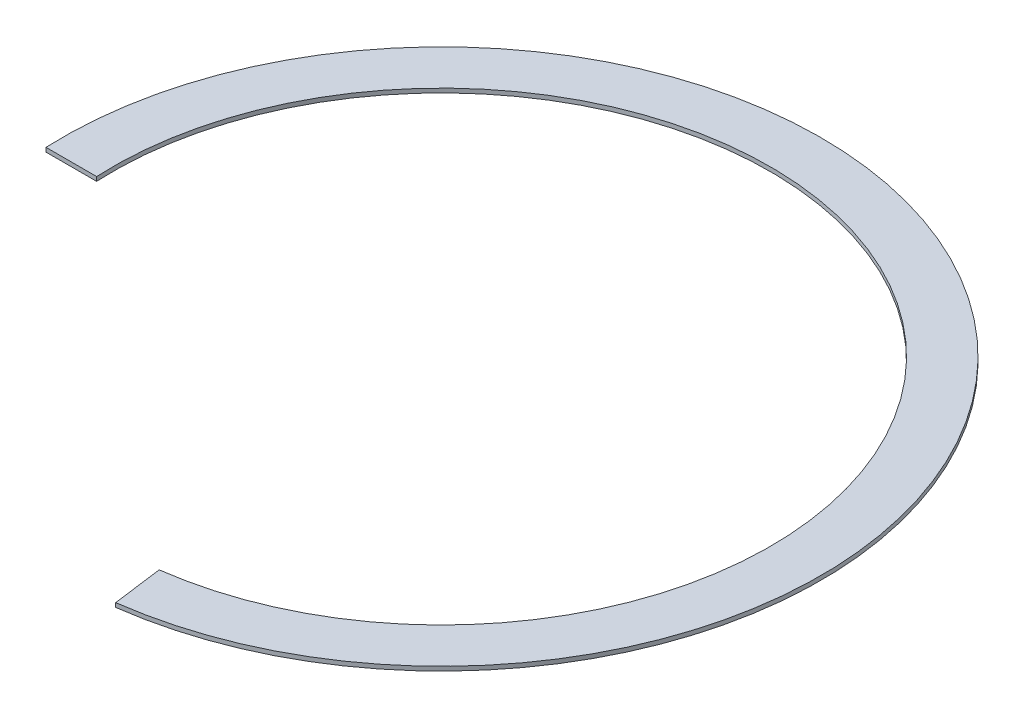
ISO-10303-21;
HEADER;
FILE_DESCRIPTION(('STEP AP214'),'2;1');
FILE_NAME('part.step','',(''),(''),'','','');
FILE_SCHEMA(('AUTOMOTIVE_DESIGN { 1 0 10303 214 1 1 1 1 }'));
ENDSEC;
DATA;
#1=APPLICATION_CONTEXT('core data for automotive mechanical design processes');
#2=APPLICATION_PROTOCOL_DEFINITION('international standard','automotive_design',2000,#1);
#3=PRODUCT_CONTEXT('',#1,'mechanical');
#4=PRODUCT('Part','Part','',(#3));
#5=PRODUCT_RELATED_PRODUCT_CATEGORY('part','',(#4));
#6=PRODUCT_DEFINITION_FORMATION('','',#4);
#7=PRODUCT_DEFINITION_CONTEXT('part definition',#1,'design');
#8=PRODUCT_DEFINITION('design','',#6,#7);
#9=PRODUCT_DEFINITION_SHAPE('','',#8);
#10=(LENGTH_UNIT() NAMED_UNIT(*) SI_UNIT(.MILLI.,.METRE.));
#11=(NAMED_UNIT(*) PLANE_ANGLE_UNIT() SI_UNIT($,.RADIAN.));
#12=(NAMED_UNIT(*) SI_UNIT($,.STERADIAN.) SOLID_ANGLE_UNIT());
#13=UNCERTAINTY_MEASURE_WITH_UNIT(LENGTH_MEASURE(1.E-05),#10,'distance_accuracy_value','');
#14=(GEOMETRIC_REPRESENTATION_CONTEXT(3) GLOBAL_UNCERTAINTY_ASSIGNED_CONTEXT((#13)) GLOBAL_UNIT_ASSIGNED_CONTEXT((#10,
#11,#12)) REPRESENTATION_CONTEXT('',''));
#15=CARTESIAN_POINT('',(0.,0.,0.));
#16=DIRECTION('',(0.,0.,1.));
#17=DIRECTION('',(1.,0.,0.));
#18=AXIS2_PLACEMENT_3D('',#15,#16,#17);
#19=CARTESIAN_POINT('',(0.,0.7,0.));
#20=DIRECTION('',(0.,-1.,0.));
#21=DIRECTION('',(0.,0.,-1.));
#22=AXIS2_PLACEMENT_3D('',#19,#20,#21);
#23=CYLINDRICAL_SURFACE('',#22,55.03);
#24=CARTESIAN_POINT('',(0.,0.,0.));
#25=DIRECTION('',(0.,-1.,0.));
#26=DIRECTION('',(0.,0.,1.));
#27=AXIS2_PLACEMENT_3D('',#24,#25,#26);
#28=CIRCLE('',#27,55.03);
#29=CARTESIAN_POINT('',(-54.9600998934954,0.,2.77278194184261));
#30=VERTEX_POINT('',#29);
#31=CARTESIAN_POINT('',(7.27821587486972,0.,54.5465716033446));
#32=VERTEX_POINT('',#31);
#33=EDGE_CURVE('E95',#30,#32,#28,.T.);
#34=ORIENTED_EDGE('',*,*,#33,.T.);
#35=DIRECTION('',(0.,-1.,0.));
#36=VECTOR('',#35,1.);
#37=CARTESIAN_POINT('',(7.27821587486972,0.7,54.5465716033446));
#38=LINE('',#37,#36);
#39=CARTESIAN_POINT('',(7.27821587486972,0.7,54.5465716033446));
#40=VERTEX_POINT('',#39);
#41=EDGE_CURVE('E11',#40,#32,#38,.T.);
#42=ORIENTED_EDGE('',*,*,#41,.F.);
#43=CARTESIAN_POINT('',(0.,0.7,0.));
#44=DIRECTION('',(0.,-1.,0.));
#45=DIRECTION('',(0.,0.,1.));
#46=AXIS2_PLACEMENT_3D('',#43,#44,#45);
#47=CIRCLE('',#46,55.03);
#48=CARTESIAN_POINT('',(-54.9600998934954,0.7,2.77278194184261));
#49=VERTEX_POINT('',#48);
#50=EDGE_CURVE('E83',#49,#40,#47,.T.);
#51=ORIENTED_EDGE('',*,*,#50,.F.);
#52=DIRECTION('',(0.,-1.,0.));
#53=VECTOR('',#52,1.);
#54=CARTESIAN_POINT('',(-54.9600998934954,0.7,2.77278194184261));
#55=LINE('',#54,#53);
#56=EDGE_CURVE('E91',#49,#30,#55,.T.);
#57=ORIENTED_EDGE('',*,*,#56,.T.);
#58=EDGE_LOOP('',(#34,#42,#51,#57));
#59=FACE_BOUND('',#58,.T.);
#60=ADVANCED_FACE('F32',(#59),#23,.F.);
#61=CARTESIAN_POINT('',(8.39712749219487,0.7,62.9322520642621));
#62=DIRECTION('',(0.991215184505624,0.,-0.132259056421413));
#63=DIRECTION('',(-0.132259056421413,0.,-0.991215184505624));
#64=AXIS2_PLACEMENT_3D('',#61,#62,#63);
#65=PLANE('',#64);
#66=DIRECTION('',(0.132259056421413,0.,0.991215184505624));
#67=VECTOR('',#66,1.);
#68=CARTESIAN_POINT('',(8.39712749219487,0.,62.9322520642621));
#69=LINE('',#68,#67);
#70=CARTESIAN_POINT('',(8.39712749219487,0.,62.9322520642621));
#71=VERTEX_POINT('',#70);
#72=EDGE_CURVE('E87',#32,#71,#69,.T.);
#73=ORIENTED_EDGE('',*,*,#72,.T.);
#74=DIRECTION('',(0.,-1.,0.));
#75=VECTOR('',#74,1.);
#76=CARTESIAN_POINT('',(8.39712749219487,0.7,62.9322520642621));
#77=LINE('',#76,#75);
#78=CARTESIAN_POINT('',(8.39712749219487,0.7,62.9322520642621));
#79=VERTEX_POINT('',#78);
#80=EDGE_CURVE('E40',#79,#71,#77,.T.);
#81=ORIENTED_EDGE('',*,*,#80,.F.);
#82=DIRECTION('',(0.132259056421413,0.,0.991215184505624));
#83=VECTOR('',#82,1.);
#84=CARTESIAN_POINT('',(8.39712749219487,0.7,62.9322520642621));
#85=LINE('',#84,#83);
#86=EDGE_CURVE('E78',#40,#79,#85,.T.);
#87=ORIENTED_EDGE('',*,*,#86,.F.);
#88=ORIENTED_EDGE('',*,*,#41,.T.);
#89=EDGE_LOOP('',(#73,#81,#87,#88));
#90=FACE_BOUND('',#89,.T.);
#91=ADVANCED_FACE('F86',(#90),#65,.F.);
#92=CARTESIAN_POINT('',(0.,0.7,0.));
#93=DIRECTION('',(0.,-1.,0.));
#94=DIRECTION('',(0.,0.,-1.));
#95=AXIS2_PLACEMENT_3D('',#92,#93,#94);
#96=CYLINDRICAL_SURFACE('',#95,63.49);
#97=CARTESIAN_POINT('',(0.,0.,0.));
#98=DIRECTION('',(0.,1.,0.));
#99=DIRECTION('',(0.,0.,1.));
#100=AXIS2_PLACEMENT_3D('',#97,#98,#99);
#101=CIRCLE('',#100,63.49);
#102=CARTESIAN_POINT('',(-63.4294236163548,0.,2.77278194184261));
#103=VERTEX_POINT('',#102);
#104=EDGE_CURVE('E65',#71,#103,#101,.T.);
#105=ORIENTED_EDGE('',*,*,#104,.T.);
#106=DIRECTION('',(0.,-1.,0.));
#107=VECTOR('',#106,1.);
#108=CARTESIAN_POINT('',(-63.4294236163548,0.7,2.77278194184261));
#109=LINE('',#108,#107);
#110=CARTESIAN_POINT('',(-63.4294236163548,0.7,2.77278194184261));
#111=VERTEX_POINT('',#110);
#112=EDGE_CURVE('E88',#111,#103,#109,.T.);
#113=ORIENTED_EDGE('',*,*,#112,.F.);
#114=CARTESIAN_POINT('',(0.,0.7,0.));
#115=DIRECTION('',(0.,1.,0.));
#116=DIRECTION('',(0.,0.,1.));
#117=AXIS2_PLACEMENT_3D('',#114,#115,#116);
#118=CIRCLE('',#117,63.49);
#119=EDGE_CURVE('E81',#79,#111,#118,.T.);
#120=ORIENTED_EDGE('',*,*,#119,.F.);
#121=ORIENTED_EDGE('',*,*,#80,.T.);
#122=EDGE_LOOP('',(#105,#113,#120,#121));
#123=FACE_BOUND('',#122,.T.);
#124=ADVANCED_FACE('F89',(#123),#96,.T.);
#125=CARTESIAN_POINT('',(-63.4294236163548,0.7,2.77278194184261));
#126=DIRECTION('',(0.,0.,-1.));
#127=DIRECTION('',(-1.,0.,0.));
#128=AXIS2_PLACEMENT_3D('',#125,#126,#127);
#129=PLANE('',#128);
#130=DIRECTION('',(1.,0.,0.));
#131=VECTOR('',#130,1.);
#132=CARTESIAN_POINT('',(-63.4294236163548,0.,2.77278194184261));
#133=LINE('',#132,#131);
#134=EDGE_CURVE('E71',#103,#30,#133,.T.);
#135=ORIENTED_EDGE('',*,*,#134,.T.);
#136=ORIENTED_EDGE('',*,*,#56,.F.);
#137=DIRECTION('',(1.,0.,0.));
#138=VECTOR('',#137,1.);
#139=CARTESIAN_POINT('',(-63.4294236163548,0.7,2.77278194184261));
#140=LINE('',#139,#138);
#141=EDGE_CURVE('E48',#111,#49,#140,.T.);
#142=ORIENTED_EDGE('',*,*,#141,.F.);
#143=ORIENTED_EDGE('',*,*,#112,.T.);
#144=EDGE_LOOP('',(#135,#136,#142,#143));
#145=FACE_BOUND('',#144,.T.);
#146=ADVANCED_FACE('F102',(#145),#129,.F.);
#147=CARTESIAN_POINT('',(0.,0.7,0.));
#148=DIRECTION('',(0.,1.,0.));
#149=DIRECTION('',(0.,0.,1.));
#150=AXIS2_PLACEMENT_3D('',#147,#148,#149);
#151=PLANE('',#150);
#152=ORIENTED_EDGE('',*,*,#50,.T.);
#153=ORIENTED_EDGE('',*,*,#86,.T.);
#154=ORIENTED_EDGE('',*,*,#119,.T.);
#155=ORIENTED_EDGE('',*,*,#141,.T.);
#156=EDGE_LOOP('',(#152,#153,#154,#155));
#157=FACE_BOUND('',#156,.T.);
#158=ADVANCED_FACE('F79',(#157),#151,.T.);
#159=CARTESIAN_POINT('',(0.,0.,0.));
#160=DIRECTION('',(0.,1.,0.));
#161=DIRECTION('',(0.,0.,1.));
#162=AXIS2_PLACEMENT_3D('',#159,#160,#161);
#163=PLANE('',#162);
#164=ORIENTED_EDGE('',*,*,#33,.F.);
#165=ORIENTED_EDGE('',*,*,#134,.F.);
#166=ORIENTED_EDGE('',*,*,#104,.F.);
#167=ORIENTED_EDGE('',*,*,#72,.F.);
#168=EDGE_LOOP('',(#164,#165,#166,#167));
#169=FACE_BOUND('',#168,.T.);
#170=ADVANCED_FACE('F105',(#169),#163,.F.);
#171=CLOSED_SHELL('',(#60,#91,#124,#146,#158,#170));
#172=MANIFOLD_SOLID_BREP('B2',#171);
#173=ADVANCED_BREP_SHAPE_REPRESENTATION('',(#18,#172),#14);
#174=SHAPE_DEFINITION_REPRESENTATION(#9,#173);
ENDSEC;
END-ISO-10303-21;
